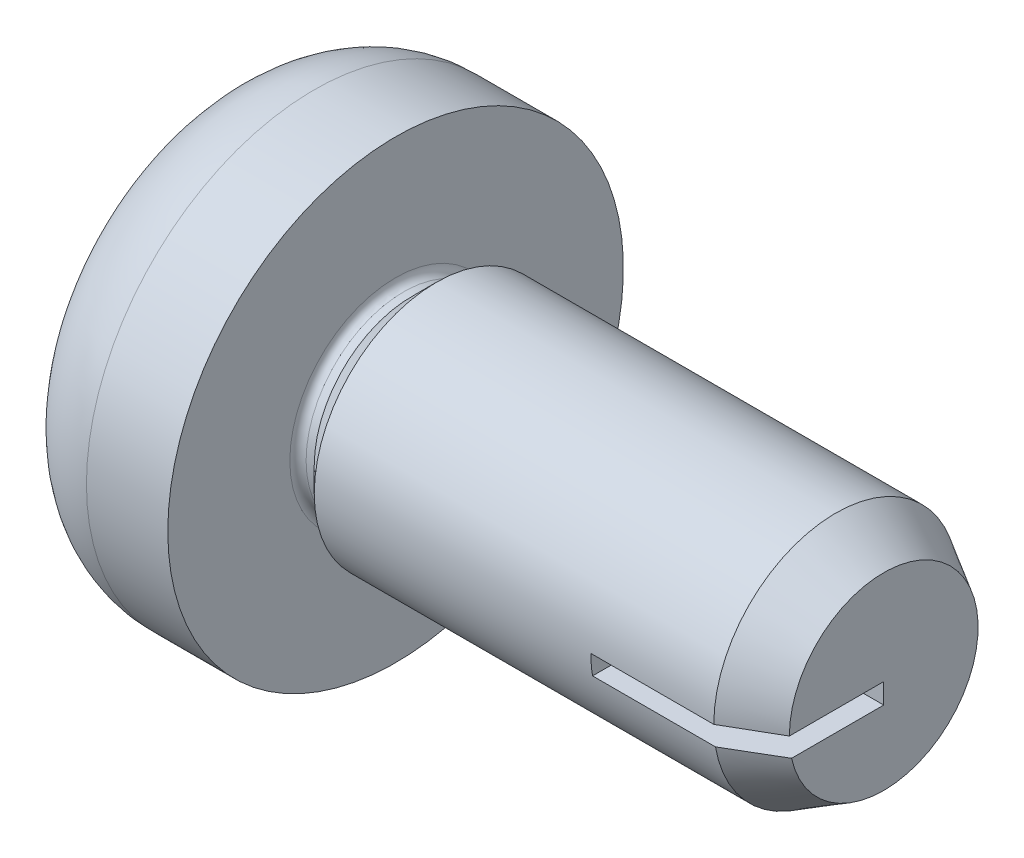
ISO-10303-21;
HEADER;
FILE_DESCRIPTION(('STEP AP214'),'2;1');
FILE_NAME('part.step','',(''),(''),'','','');
FILE_SCHEMA(('AUTOMOTIVE_DESIGN { 1 0 10303 214 1 1 1 1 }'));
ENDSEC;
DATA;
#1=APPLICATION_CONTEXT('core data for automotive mechanical design processes');
#2=APPLICATION_PROTOCOL_DEFINITION('international standard','automotive_design',2000,#1);
#3=PRODUCT_CONTEXT('',#1,'mechanical');
#4=PRODUCT('Part','Part','',(#3));
#5=PRODUCT_RELATED_PRODUCT_CATEGORY('part','',(#4));
#6=PRODUCT_DEFINITION_FORMATION('','',#4);
#7=PRODUCT_DEFINITION_CONTEXT('part definition',#1,'design');
#8=PRODUCT_DEFINITION('design','',#6,#7);
#9=PRODUCT_DEFINITION_SHAPE('','',#8);
#10=(LENGTH_UNIT() NAMED_UNIT(*) SI_UNIT(.MILLI.,.METRE.));
#11=(NAMED_UNIT(*) PLANE_ANGLE_UNIT() SI_UNIT($,.RADIAN.));
#12=(NAMED_UNIT(*) SI_UNIT($,.STERADIAN.) SOLID_ANGLE_UNIT());
#13=UNCERTAINTY_MEASURE_WITH_UNIT(LENGTH_MEASURE(1.E-05),#10,'distance_accuracy_value','');
#14=(GEOMETRIC_REPRESENTATION_CONTEXT(3) GLOBAL_UNCERTAINTY_ASSIGNED_CONTEXT((#13)) GLOBAL_UNIT_ASSIGNED_CONTEXT((#10,
#11,#12)) REPRESENTATION_CONTEXT('',''));
#15=CARTESIAN_POINT('',(0.,0.,0.));
#16=DIRECTION('',(0.,0.,1.));
#17=DIRECTION('',(1.,0.,0.));
#18=AXIS2_PLACEMENT_3D('',#15,#16,#17);
#19=CARTESIAN_POINT('',(0.,0.,0.));
#20=DIRECTION('',(-1.,0.,0.));
#21=DIRECTION('',(0.,0.,1.));
#22=AXIS2_PLACEMENT_3D('',#19,#20,#21);
#23=CYLINDRICAL_SURFACE('',#22,1.5);
#24=CARTESIAN_POINT('',(2.7,0.,0.));
#25=DIRECTION('',(-1.,0.,0.));
#26=DIRECTION('',(0.,0.,1.));
#27=AXIS2_PLACEMENT_3D('',#24,#25,#26);
#28=CIRCLE('',#27,1.5);
#29=CARTESIAN_POINT('',(2.7,0.,1.5));
#30=VERTEX_POINT('',#29);
#31=EDGE_CURVE('E240',#30,#30,#28,.T.);
#32=ORIENTED_EDGE('',*,*,#31,.F.);
#33=EDGE_LOOP('',(#32));
#34=FACE_BOUND('',#33,.T.);
#35=DIRECTION('',(-1.,0.,0.));
#36=VECTOR('',#35,1.);
#37=CARTESIAN_POINT('',(0.,0.,1.5));
#38=LINE('',#37,#36);
#39=CARTESIAN_POINT('',(7.61110272542657,0.,1.5));
#40=VERTEX_POINT('',#39);
#41=CARTESIAN_POINT('',(6.1,0.,1.5));
#42=VERTEX_POINT('',#41);
#43=EDGE_CURVE('E382',#40,#42,#38,.T.);
#44=ORIENTED_EDGE('',*,*,#43,.F.);
#45=CARTESIAN_POINT('',(7.61110272542657,0.,0.));
#46=DIRECTION('',(-1.,0.,0.));
#47=DIRECTION('',(0.,0.,1.));
#48=AXIS2_PLACEMENT_3D('',#45,#46,#47);
#49=CIRCLE('',#48,1.5);
#50=CARTESIAN_POINT('',(7.61110272542657,-0.25,1.4790199457749));
#51=VERTEX_POINT('',#50);
#52=EDGE_CURVE('E379',#40,#51,#49,.T.);
#53=ORIENTED_EDGE('',*,*,#52,.T.);
#54=DIRECTION('',(-1.,0.,0.));
#55=VECTOR('',#54,1.);
#56=CARTESIAN_POINT('',(0.,-0.250000000000001,1.4790199457749));
#57=LINE('',#56,#55);
#58=CARTESIAN_POINT('',(6.1,-0.25,1.4790199457749));
#59=VERTEX_POINT('',#58);
#60=EDGE_CURVE('E386',#59,#51,#57,.F.);
#61=ORIENTED_EDGE('',*,*,#60,.F.);
#62=CARTESIAN_POINT('',(6.1,0.,0.));
#63=DIRECTION('',(1.,0.,0.));
#64=DIRECTION('',(0.,0.,-1.));
#65=AXIS2_PLACEMENT_3D('',#62,#63,#64);
#66=CIRCLE('',#65,1.5);
#67=EDGE_CURVE('E47',#42,#59,#66,.T.);
#68=ORIENTED_EDGE('',*,*,#67,.F.);
#69=EDGE_LOOP('',(#44,#53,#61,#68));
#70=FACE_BOUND('',#69,.T.);
#71=ADVANCED_FACE('F76',(#34,#70),#23,.T.);
#72=CARTESIAN_POINT('',(7.61110272542657,0.,0.));
#73=DIRECTION('',(-1.,0.,0.));
#74=DIRECTION('',(0.,0.,1.));
#75=AXIS2_PLACEMENT_3D('',#72,#73,#74);
#76=CONICAL_SURFACE('',#75,1.5,0.523598775598293);
#77=ORIENTED_EDGE('',*,*,#52,.F.);
#78=DIRECTION('',(-0.866025403784442,0.,0.499999999999995));
#79=VECTOR('',#78,1.);
#80=CARTESIAN_POINT('',(10.2091789367799,0.,0.));
#81=LINE('',#80,#79);
#82=CARTESIAN_POINT('',(8.2,0.,1.16));
#83=VERTEX_POINT('',#82);
#84=EDGE_CURVE('E384',#40,#83,#81,.F.);
#85=ORIENTED_EDGE('',*,*,#84,.T.);
#86=CARTESIAN_POINT('',(8.2,0.,0.));
#87=DIRECTION('',(-1.,0.,0.));
#88=DIRECTION('',(0.,0.,1.));
#89=AXIS2_PLACEMENT_3D('',#86,#87,#88);
#90=CIRCLE('',#89,1.16);
#91=CARTESIAN_POINT('',(8.2,-0.25,1.13274004078606));
#92=VERTEX_POINT('',#91);
#93=EDGE_CURVE('E238',#83,#92,#90,.T.);
#94=ORIENTED_EDGE('',*,*,#93,.T.);
#95=CARTESIAN_POINT('',(9.41814185697318,-0.25,0.382203986386483));
#96=CARTESIAN_POINT('',(9.39723319512439,-0.25,0.396622432472531));
#97=CARTESIAN_POINT('',(9.37621736160206,-0.25,0.410883489403972));
#98=CARTESIAN_POINT('',(9.3340175932902,-0.25,0.439152569856273));
#99=CARTESIAN_POINT('',(9.31283366728643,-0.25,0.453160606478108));
#100=CARTESIAN_POINT('',(9.24910170124372,-0.25,0.494896164896426));
#101=CARTESIAN_POINT('',(9.20636766970512,-0.25,0.522339085516596));
#102=CARTESIAN_POINT('',(9.12060440125441,-0.25,0.576735461075968));
#103=CARTESIAN_POINT('',(9.07757523356054,-0.25,0.603689025716695));
#104=CARTESIAN_POINT('',(8.9913095492911,-0.25,0.657266142328872));
#105=CARTESIAN_POINT('',(8.9480730235488,-0.25,0.683889679520685));
#106=CARTESIAN_POINT('',(8.8218598791878,-0.25,0.761143065792755));
#107=CARTESIAN_POINT('',(8.73869474512981,-0.25,0.811464507635569));
#108=CARTESIAN_POINT('',(8.5720741029365,-0.25,0.911624729010411));
#109=CARTESIAN_POINT('',(8.48861859150198,-0.25,0.961463503033985));
#110=CARTESIAN_POINT('',(8.23795252732004,-0.25,1.11055290730823));
#111=CARTESIAN_POINT('',(8.07047613568723,-0.25,1.20935625450731));
#112=CARTESIAN_POINT('',(7.77526163481782,-0.25,1.3828718387951));
#113=CARTESIAN_POINT('',(7.64759083644122,-0.25,1.45769905707308));
#114=CARTESIAN_POINT('',(7.39212620609127,-0.25,1.60714336352689));
#115=CARTESIAN_POINT('',(7.26433237410952,-0.25,1.68176045168836));
#116=CARTESIAN_POINT('',(7.0087172173291,-0.25,1.83082709807698));
#117=CARTESIAN_POINT('',(6.88089592520653,-0.25,1.90527671238543));
#118=CARTESIAN_POINT('',(6.62519555777105,-0.25,2.05407620843158));
#119=CARTESIAN_POINT('',(6.49731648254642,-0.25,2.12842609032095));
#120=CARTESIAN_POINT('',(6.36941931140605,-0.25,2.20274480142775));
#121=B_SPLINE_CURVE_WITH_KNOTS('',3,(#95,#96,#97,#98,#99,#100,#101,#102,#103,#104,#105,#106,
#107,#108,#109,#110,#111,#112,#113,#114,#115,#116,#117,#118,#119,#120),.UNSPECIFIED.,.F.,.F.,(4,
2,2,2,2,2,2,2,2,2,2,2,4),(0.,0.076191962796665,0.152379969123876,0.304734924671154,
0.457055293432602,0.60938245909972,0.90099209824417,1.19260506147505,1.77594908814432,
2.2198978958494,2.6638467338862,3.10761381509469,3.55138022062236),.UNSPECIFIED.);
#122=EDGE_CURVE('E388',#92,#51,#121,.T.);
#123=ORIENTED_EDGE('',*,*,#122,.T.);
#124=EDGE_LOOP('',(#77,#85,#94,#123));
#125=FACE_BOUND('',#124,.T.);
#126=ADVANCED_FACE('F398',(#125),#76,.T.);
#127=CARTESIAN_POINT('',(8.2,1.5,0.));
#128=DIRECTION('',(-1.,0.,0.));
#129=DIRECTION('',(0.,0.,1.));
#130=AXIS2_PLACEMENT_3D('',#127,#128,#129);
#131=PLANE('',#130);
#132=DIRECTION('',(0.,0.,1.));
#133=VECTOR('',#132,1.);
#134=CARTESIAN_POINT('',(8.2,0.,0.));
#135=LINE('',#134,#133);
#136=CARTESIAN_POINT('',(8.2,0.,0.));
#137=VERTEX_POINT('',#136);
#138=EDGE_CURVE('E84',#137,#83,#135,.T.);
#139=ORIENTED_EDGE('',*,*,#138,.F.);
#140=DIRECTION('',(0.,1.,0.));
#141=VECTOR('',#140,1.);
#142=CARTESIAN_POINT('',(8.2,0.,0.));
#143=LINE('',#142,#141);
#144=CARTESIAN_POINT('',(8.2,-0.25,0.));
#145=VERTEX_POINT('',#144);
#146=EDGE_CURVE('E228',#145,#137,#143,.T.);
#147=ORIENTED_EDGE('',*,*,#146,.F.);
#148=DIRECTION('',(0.,0.,-1.));
#149=VECTOR('',#148,1.);
#150=CARTESIAN_POINT('',(8.2,-0.25,0.));
#151=LINE('',#150,#149);
#152=EDGE_CURVE('E239',#92,#145,#151,.T.);
#153=ORIENTED_EDGE('',*,*,#152,.F.);
#154=ORIENTED_EDGE('',*,*,#93,.F.);
#155=EDGE_LOOP('',(#139,#147,#153,#154));
#156=FACE_BOUND('',#155,.T.);
#157=ADVANCED_FACE('F236',(#156),#131,.F.);
#158=CARTESIAN_POINT('',(0.,0.,0.));
#159=DIRECTION('',(1.,0.,0.));
#160=DIRECTION('',(0.,0.,-1.));
#161=AXIS2_PLACEMENT_3D('',#158,#159,#160);
#162=PLANE('',#161);
#163=CARTESIAN_POINT('',(0.,0.,0.));
#164=DIRECTION('',(-1.,0.,0.));
#165=DIRECTION('',(0.,0.,1.));
#166=AXIS2_PLACEMENT_3D('',#163,#164,#165);
#167=CIRCLE('',#166,1.6);
#168=CARTESIAN_POINT('',(0.,0.,1.6));
#169=VERTEX_POINT('',#168);
#170=EDGE_CURVE('E266',#169,#169,#167,.T.);
#171=ORIENTED_EDGE('',*,*,#170,.T.);
#172=EDGE_LOOP('',(#171));
#173=FACE_BOUND('',#172,.T.);
#174=DIRECTION('',(0.,0.,-1.));
#175=VECTOR('',#174,1.);
#176=CARTESIAN_POINT('',(0.,-0.395,0.394999999999999));
#177=LINE('',#176,#175);
#178=CARTESIAN_POINT('',(0.,-0.395,1.55));
#179=VERTEX_POINT('',#178);
#180=CARTESIAN_POINT('',(0.,-0.395,0.704999999999999));
#181=VERTEX_POINT('',#180);
#182=EDGE_CURVE('E315',#179,#181,#177,.T.);
#183=ORIENTED_EDGE('',*,*,#182,.T.);
#184=DIRECTION('',(0.,0.707106781186548,0.707106781186547));
#185=VECTOR('',#184,1.);
#186=CARTESIAN_POINT('',(0.,-0.705,0.394999999999999));
#187=LINE('',#186,#185);
#188=CARTESIAN_POINT('',(0.,-0.705,0.394999999999999));
#189=VERTEX_POINT('',#188);
#190=EDGE_CURVE('E374',#189,#181,#187,.T.);
#191=ORIENTED_EDGE('',*,*,#190,.F.);
#192=DIRECTION('',(0.,-1.,0.));
#193=VECTOR('',#192,1.);
#194=CARTESIAN_POINT('',(0.,-0.395,0.394999999999999));
#195=LINE('',#194,#193);
#196=CARTESIAN_POINT('',(0.,-1.55,0.395));
#197=VERTEX_POINT('',#196);
#198=EDGE_CURVE('E313',#189,#197,#195,.T.);
#199=ORIENTED_EDGE('',*,*,#198,.T.);
#200=DIRECTION('',(0.,0.,-1.));
#201=VECTOR('',#200,1.);
#202=CARTESIAN_POINT('',(0.,-1.55,-0.395));
#203=LINE('',#202,#201);
#204=CARTESIAN_POINT('',(0.,-1.55,-0.395));
#205=VERTEX_POINT('',#204);
#206=EDGE_CURVE('E310',#197,#205,#203,.T.);
#207=ORIENTED_EDGE('',*,*,#206,.T.);
#208=DIRECTION('',(0.,1.,0.));
#209=VECTOR('',#208,1.);
#210=CARTESIAN_POINT('',(0.,-0.395,-0.395));
#211=LINE('',#210,#209);
#212=CARTESIAN_POINT('',(0.,-0.705,-0.394999999999999));
#213=VERTEX_POINT('',#212);
#214=EDGE_CURVE('E307',#205,#213,#211,.T.);
#215=ORIENTED_EDGE('',*,*,#214,.T.);
#216=DIRECTION('',(0.,-0.707106781186548,0.707106781186547));
#217=VECTOR('',#216,1.);
#218=CARTESIAN_POINT('',(0.,-0.705,-0.394999999999999));
#219=LINE('',#218,#217);
#220=CARTESIAN_POINT('',(0.,-0.395,-0.704999999999999));
#221=VERTEX_POINT('',#220);
#222=EDGE_CURVE('E365',#221,#213,#219,.T.);
#223=ORIENTED_EDGE('',*,*,#222,.F.);
#224=DIRECTION('',(0.,0.,-1.));
#225=VECTOR('',#224,1.);
#226=CARTESIAN_POINT('',(0.,-0.395,-1.55));
#227=LINE('',#226,#225);
#228=CARTESIAN_POINT('',(0.,-0.395,-1.55));
#229=VERTEX_POINT('',#228);
#230=EDGE_CURVE('E305',#221,#229,#227,.T.);
#231=ORIENTED_EDGE('',*,*,#230,.T.);
#232=DIRECTION('',(0.,1.,0.));
#233=VECTOR('',#232,1.);
#234=CARTESIAN_POINT('',(0.,0.395,-1.55));
#235=LINE('',#234,#233);
#236=CARTESIAN_POINT('',(0.,0.395,-1.55));
#237=VERTEX_POINT('',#236);
#238=EDGE_CURVE('E302',#229,#237,#235,.T.);
#239=ORIENTED_EDGE('',*,*,#238,.T.);
#240=DIRECTION('',(0.,0.,1.));
#241=VECTOR('',#240,1.);
#242=CARTESIAN_POINT('',(0.,0.395,-1.55));
#243=LINE('',#242,#241);
#244=CARTESIAN_POINT('',(0.,0.395,-0.704999999999999));
#245=VERTEX_POINT('',#244);
#246=EDGE_CURVE('E299',#237,#245,#243,.T.);
#247=ORIENTED_EDGE('',*,*,#246,.T.);
#248=DIRECTION('',(0.,-0.707106781186548,-0.707106781186547));
#249=VECTOR('',#248,1.);
#250=CARTESIAN_POINT('',(0.,0.705,-0.395));
#251=LINE('',#250,#249);
#252=CARTESIAN_POINT('',(0.,0.705,-0.395));
#253=VERTEX_POINT('',#252);
#254=EDGE_CURVE('E357',#253,#245,#251,.T.);
#255=ORIENTED_EDGE('',*,*,#254,.F.);
#256=DIRECTION('',(0.,1.,0.));
#257=VECTOR('',#256,1.);
#258=CARTESIAN_POINT('',(0.,1.55,-0.395));
#259=LINE('',#258,#257);
#260=CARTESIAN_POINT('',(0.,1.55,-0.395));
#261=VERTEX_POINT('',#260);
#262=EDGE_CURVE('E329',#253,#261,#259,.T.);
#263=ORIENTED_EDGE('',*,*,#262,.T.);
#264=DIRECTION('',(0.,0.,1.));
#265=VECTOR('',#264,1.);
#266=CARTESIAN_POINT('',(0.,1.55,-0.395));
#267=LINE('',#266,#265);
#268=CARTESIAN_POINT('',(0.,1.55,0.395));
#269=VERTEX_POINT('',#268);
#270=EDGE_CURVE('E326',#261,#269,#267,.T.);
#271=ORIENTED_EDGE('',*,*,#270,.T.);
#272=DIRECTION('',(0.,-1.,0.));
#273=VECTOR('',#272,1.);
#274=CARTESIAN_POINT('',(0.,1.55,0.395));
#275=LINE('',#274,#273);
#276=CARTESIAN_POINT('',(0.,0.705,0.395));
#277=VERTEX_POINT('',#276);
#278=EDGE_CURVE('E323',#269,#277,#275,.T.);
#279=ORIENTED_EDGE('',*,*,#278,.T.);
#280=DIRECTION('',(0.,0.707106781186548,-0.707106781186547));
#281=VECTOR('',#280,1.);
#282=CARTESIAN_POINT('',(0.,0.705,0.395));
#283=LINE('',#282,#281);
#284=CARTESIAN_POINT('',(0.,0.395,0.704999999999999));
#285=VERTEX_POINT('',#284);
#286=EDGE_CURVE('E347',#285,#277,#283,.T.);
#287=ORIENTED_EDGE('',*,*,#286,.F.);
#288=DIRECTION('',(0.,0.,1.));
#289=VECTOR('',#288,1.);
#290=CARTESIAN_POINT('',(0.,0.395,0.394999999999999));
#291=LINE('',#290,#289);
#292=CARTESIAN_POINT('',(0.,0.395,1.55));
#293=VERTEX_POINT('',#292);
#294=EDGE_CURVE('E321',#285,#293,#291,.T.);
#295=ORIENTED_EDGE('',*,*,#294,.T.);
#296=DIRECTION('',(0.,-1.,0.));
#297=VECTOR('',#296,1.);
#298=CARTESIAN_POINT('',(0.,0.395,1.55));
#299=LINE('',#298,#297);
#300=EDGE_CURVE('E318',#293,#179,#299,.T.);
#301=ORIENTED_EDGE('',*,*,#300,.T.);
#302=EDGE_LOOP('',(#183,#191,#199,#207,#215,#223,#231,#239,#247,#255,#263,#271,#279,#287,#295,#301));
#303=FACE_BOUND('',#302,.T.);
#304=ADVANCED_FACE('F430',(#173,#303),#162,.F.);
#305=CARTESIAN_POINT('',(2.7,0.,0.));
#306=DIRECTION('',(1.,0.,0.));
#307=DIRECTION('',(0.,0.,-1.));
#308=AXIS2_PLACEMENT_3D('',#305,#306,#307);
#309=CONICAL_SURFACE('',#308,1.5,0.785398163397452);
#310=CARTESIAN_POINT('',(2.4,0.,0.));
#311=DIRECTION('',(-1.,0.,0.));
#312=DIRECTION('',(0.,0.,1.));
#313=AXIS2_PLACEMENT_3D('',#310,#311,#312);
#314=CIRCLE('',#313,1.2);
#315=CARTESIAN_POINT('',(2.4,0.,1.2));
#316=VERTEX_POINT('',#315);
#317=EDGE_CURVE('E282',#316,#316,#314,.T.);
#318=ORIENTED_EDGE('',*,*,#317,.F.);
#319=EDGE_LOOP('',(#318));
#320=FACE_BOUND('',#319,.T.);
#321=ORIENTED_EDGE('',*,*,#31,.T.);
#322=EDGE_LOOP('',(#321));
#323=FACE_BOUND('',#322,.T.);
#324=ADVANCED_FACE('F426',(#320,#323),#309,.T.);
#325=CARTESIAN_POINT('',(0.,0.,0.));
#326=DIRECTION('',(-1.,0.,0.));
#327=DIRECTION('',(0.,0.,1.));
#328=AXIS2_PLACEMENT_3D('',#325,#326,#327);
#329=CYLINDRICAL_SURFACE('',#328,1.2);
#330=CARTESIAN_POINT('',(2.3,0.,0.));
#331=DIRECTION('',(-1.,0.,0.));
#332=DIRECTION('',(0.,0.,1.));
#333=AXIS2_PLACEMENT_3D('',#330,#331,#332);
#334=CIRCLE('',#333,1.2);
#335=CARTESIAN_POINT('',(2.3,0.,1.2));
#336=VERTEX_POINT('',#335);
#337=EDGE_CURVE('E285',#336,#336,#334,.T.);
#338=ORIENTED_EDGE('',*,*,#337,.F.);
#339=EDGE_LOOP('',(#338));
#340=FACE_BOUND('',#339,.T.);
#341=ORIENTED_EDGE('',*,*,#317,.T.);
#342=EDGE_LOOP('',(#341));
#343=FACE_BOUND('',#342,.T.);
#344=ADVANCED_FACE('F553',(#340,#343),#329,.T.);
#345=CARTESIAN_POINT('',(2.3,0.,0.));
#346=DIRECTION('',(-1.,0.,0.));
#347=DIRECTION('',(0.,0.,1.));
#348=AXIS2_PLACEMENT_3D('',#345,#346,#347);
#349=TOROIDAL_SURFACE('',#348,1.3,0.1);
#350=CARTESIAN_POINT('',(2.2,0.,0.));
#351=DIRECTION('',(-1.,0.,0.));
#352=DIRECTION('',(0.,0.,1.));
#353=AXIS2_PLACEMENT_3D('',#350,#351,#352);
#354=CIRCLE('',#353,1.3);
#355=CARTESIAN_POINT('',(2.2,0.,1.3));
#356=VERTEX_POINT('',#355);
#357=EDGE_CURVE('E288',#356,#356,#354,.T.);
#358=ORIENTED_EDGE('',*,*,#357,.F.);
#359=EDGE_LOOP('',(#358));
#360=FACE_BOUND('',#359,.T.);
#361=ORIENTED_EDGE('',*,*,#337,.T.);
#362=EDGE_LOOP('',(#361));
#363=FACE_BOUND('',#362,.T.);
#364=ADVANCED_FACE('F550',(#360,#363),#349,.F.);
#365=CARTESIAN_POINT('',(2.2,2.8,0.));
#366=DIRECTION('',(-1.,0.,0.));
#367=DIRECTION('',(0.,0.,1.));
#368=AXIS2_PLACEMENT_3D('',#365,#366,#367);
#369=PLANE('',#368);
#370=CARTESIAN_POINT('',(2.2,0.,0.));
#371=DIRECTION('',(-1.,0.,0.));
#372=DIRECTION('',(0.,0.,1.));
#373=AXIS2_PLACEMENT_3D('',#370,#371,#372);
#374=CIRCLE('',#373,2.8);
#375=CARTESIAN_POINT('',(2.2,0.,2.8));
#376=VERTEX_POINT('',#375);
#377=EDGE_CURVE('E291',#376,#376,#374,.T.);
#378=ORIENTED_EDGE('',*,*,#377,.F.);
#379=EDGE_LOOP('',(#378));
#380=FACE_BOUND('',#379,.T.);
#381=ORIENTED_EDGE('',*,*,#357,.T.);
#382=EDGE_LOOP('',(#381));
#383=FACE_BOUND('',#382,.T.);
#384=ADVANCED_FACE('F546',(#380,#383),#369,.F.);
#385=CARTESIAN_POINT('',(0.,0.,0.));
#386=DIRECTION('',(-1.,0.,0.));
#387=DIRECTION('',(0.,0.,1.));
#388=AXIS2_PLACEMENT_3D('',#385,#386,#387);
#389=CYLINDRICAL_SURFACE('',#388,2.8);
#390=CARTESIAN_POINT('',(1.2,0.,0.));
#391=DIRECTION('',(-1.,0.,0.));
#392=DIRECTION('',(0.,0.,1.));
#393=AXIS2_PLACEMENT_3D('',#390,#391,#392);
#394=CIRCLE('',#393,2.8);
#395=CARTESIAN_POINT('',(1.2,0.,2.8));
#396=VERTEX_POINT('',#395);
#397=EDGE_CURVE('E294',#396,#396,#394,.T.);
#398=ORIENTED_EDGE('',*,*,#397,.F.);
#399=EDGE_LOOP('',(#398));
#400=FACE_BOUND('',#399,.T.);
#401=ORIENTED_EDGE('',*,*,#377,.T.);
#402=EDGE_LOOP('',(#401));
#403=FACE_BOUND('',#402,.T.);
#404=ADVANCED_FACE('F542',(#400,#403),#389,.T.);
#405=CARTESIAN_POINT('',(1.2,0.,0.));
#406=DIRECTION('',(-1.,0.,0.));
#407=DIRECTION('',(0.,0.,1.));
#408=AXIS2_PLACEMENT_3D('',#405,#406,#407);
#409=TOROIDAL_SURFACE('',#408,1.6,1.2);
#410=ORIENTED_EDGE('',*,*,#170,.F.);
#411=EDGE_LOOP('',(#410));
#412=FACE_BOUND('',#411,.T.);
#413=ORIENTED_EDGE('',*,*,#397,.T.);
#414=EDGE_LOOP('',(#413));
#415=FACE_BOUND('',#414,.T.);
#416=ADVANCED_FACE('F536',(#412,#415),#409,.T.);
#417=CARTESIAN_POINT('',(1.4,1.55,-0.395));
#418=DIRECTION('',(0.,0.,1.));
#419=DIRECTION('',(1.,0.,0.));
#420=AXIS2_PLACEMENT_3D('',#417,#418,#419);
#421=PLANE('',#420);
#422=DIRECTION('',(-1.,0.,0.));
#423=VECTOR('',#422,1.);
#424=CARTESIAN_POINT('',(1.83840620433566,0.705,-0.395));
#425=LINE('',#424,#423);
#426=CARTESIAN_POINT('',(1.4,0.705,-0.395));
#427=VERTEX_POINT('',#426);
#428=EDGE_CURVE('E355',#427,#253,#425,.T.);
#429=ORIENTED_EDGE('',*,*,#428,.F.);
#430=DIRECTION('',(0.,1.,0.));
#431=VECTOR('',#430,1.);
#432=CARTESIAN_POINT('',(1.4,1.55,-0.395));
#433=LINE('',#432,#431);
#434=CARTESIAN_POINT('',(1.4,1.04044167202731,-0.395));
#435=VERTEX_POINT('',#434);
#436=EDGE_CURVE('E270',#427,#435,#433,.T.);
#437=ORIENTED_EDGE('',*,*,#436,.T.);
#438=DIRECTION('',(-0.939692620785908,0.342020143325669,0.));
#439=VECTOR('',#438,1.);
#440=CARTESIAN_POINT('',(0.,1.55,-0.395));
#441=LINE('',#440,#439);
#442=EDGE_CURVE('E263',#435,#261,#441,.T.);
#443=ORIENTED_EDGE('',*,*,#442,.T.);
#444=ORIENTED_EDGE('',*,*,#262,.F.);
#445=EDGE_LOOP('',(#429,#437,#443,#444));
#446=FACE_BOUND('',#445,.T.);
#447=ADVANCED_FACE('F503',(#446),#421,.T.);
#448=CARTESIAN_POINT('',(0.,1.55,-0.395));
#449=DIRECTION('',(-0.342020143325669,-0.939692620785908,0.));
#450=DIRECTION('',(0.939692620785908,-0.342020143325669,0.));
#451=AXIS2_PLACEMENT_3D('',#448,#449,#450);
#452=PLANE('',#451);
#453=ORIENTED_EDGE('',*,*,#270,.F.);
#454=ORIENTED_EDGE('',*,*,#442,.F.);
#455=DIRECTION('',(0.,0.,1.));
#456=VECTOR('',#455,1.);
#457=CARTESIAN_POINT('',(1.4,1.04044167202731,-0.395000000000001));
#458=LINE('',#457,#456);
#459=CARTESIAN_POINT('',(1.4,1.04044167202732,0.395));
#460=VERTEX_POINT('',#459);
#461=EDGE_CURVE('E267',#435,#460,#458,.T.);
#462=ORIENTED_EDGE('',*,*,#461,.T.);
#463=DIRECTION('',(-0.939692620785908,0.342020143325669,0.));
#464=VECTOR('',#463,1.);
#465=CARTESIAN_POINT('',(1.23623111018328,1.10004867321942,0.395));
#466=LINE('',#465,#464);
#467=EDGE_CURVE('E257',#460,#269,#466,.T.);
#468=ORIENTED_EDGE('',*,*,#467,.T.);
#469=EDGE_LOOP('',(#453,#454,#462,#468));
#470=FACE_BOUND('',#469,.T.);
#471=ADVANCED_FACE('F78',(#470),#452,.T.);
#472=CARTESIAN_POINT('',(1.4,1.55,0.395));
#473=DIRECTION('',(0.,0.,-1.));
#474=DIRECTION('',(0.,1.,0.));
#475=AXIS2_PLACEMENT_3D('',#472,#473,#474);
#476=PLANE('',#475);
#477=DIRECTION('',(-1.,0.,0.));
#478=VECTOR('',#477,1.);
#479=CARTESIAN_POINT('',(1.83840620433566,0.705,0.395));
#480=LINE('',#479,#478);
#481=CARTESIAN_POINT('',(1.4,0.705,0.395));
#482=VERTEX_POINT('',#481);
#483=EDGE_CURVE('E346',#482,#277,#480,.T.);
#484=ORIENTED_EDGE('',*,*,#483,.T.);
#485=ORIENTED_EDGE('',*,*,#278,.F.);
#486=ORIENTED_EDGE('',*,*,#467,.F.);
#487=DIRECTION('',(0.,-1.,0.));
#488=VECTOR('',#487,1.);
#489=CARTESIAN_POINT('',(1.4,1.55,0.395));
#490=LINE('',#489,#488);
#491=EDGE_CURVE('E269',#460,#482,#490,.T.);
#492=ORIENTED_EDGE('',*,*,#491,.T.);
#493=EDGE_LOOP('',(#484,#485,#486,#492));
#494=FACE_BOUND('',#493,.T.);
#495=ADVANCED_FACE('F453',(#494),#476,.T.);
#496=CARTESIAN_POINT('',(1.4,0.395,0.394999999999999));
#497=DIRECTION('',(0.,-1.,0.));
#498=DIRECTION('',(0.,0.,-1.));
#499=AXIS2_PLACEMENT_3D('',#496,#497,#498);
#500=PLANE('',#499);
#501=DIRECTION('',(-1.,0.,0.));
#502=VECTOR('',#501,1.);
#503=CARTESIAN_POINT('',(1.83840620433566,0.395,0.704999999999999));
#504=LINE('',#503,#502);
#505=CARTESIAN_POINT('',(1.4,0.395,0.704999999999999));
#506=VERTEX_POINT('',#505);
#507=EDGE_CURVE('E344',#506,#285,#504,.T.);
#508=ORIENTED_EDGE('',*,*,#507,.F.);
#509=DIRECTION('',(0.,0.,1.));
#510=VECTOR('',#509,1.);
#511=CARTESIAN_POINT('',(1.4,0.395,0.394999999999999));
#512=LINE('',#511,#510);
#513=CARTESIAN_POINT('',(1.4,0.395,1.04044167202731));
#514=VERTEX_POINT('',#513);
#515=EDGE_CURVE('E261',#506,#514,#512,.T.);
#516=ORIENTED_EDGE('',*,*,#515,.T.);
#517=DIRECTION('',(-0.939692620785908,0.,0.342020143325669));
#518=VECTOR('',#517,1.);
#519=CARTESIAN_POINT('',(0.,0.395,1.55));
#520=LINE('',#519,#518);
#521=EDGE_CURVE('E254',#514,#293,#520,.T.);
#522=ORIENTED_EDGE('',*,*,#521,.T.);
#523=ORIENTED_EDGE('',*,*,#294,.F.);
#524=EDGE_LOOP('',(#508,#516,#522,#523));
#525=FACE_BOUND('',#524,.T.);
#526=ADVANCED_FACE('F445',(#525),#500,.T.);
#527=CARTESIAN_POINT('',(0.,0.395,1.55));
#528=DIRECTION('',(-0.342020143325669,0.,-0.939692620785908));
#529=DIRECTION('',(-0.939692620785908,0.,0.342020143325669));
#530=AXIS2_PLACEMENT_3D('',#527,#528,#529);
#531=PLANE('',#530);
#532=ORIENTED_EDGE('',*,*,#300,.F.);
#533=ORIENTED_EDGE('',*,*,#521,.F.);
#534=DIRECTION('',(0.,-1.,0.));
#535=VECTOR('',#534,1.);
#536=CARTESIAN_POINT('',(1.4,0.395,1.04044167202731));
#537=LINE('',#536,#535);
#538=CARTESIAN_POINT('',(1.4,-0.395,1.04044167202731));
#539=VERTEX_POINT('',#538);
#540=EDGE_CURVE('E258',#514,#539,#537,.T.);
#541=ORIENTED_EDGE('',*,*,#540,.T.);
#542=DIRECTION('',(-0.939692620785908,0.,0.342020143325669));
#543=VECTOR('',#542,1.);
#544=CARTESIAN_POINT('',(1.60744095477726,-0.395,0.96493933912063));
#545=LINE('',#544,#543);
#546=EDGE_CURVE('E246',#539,#179,#545,.T.);
#547=ORIENTED_EDGE('',*,*,#546,.T.);
#548=EDGE_LOOP('',(#532,#533,#541,#547));
#549=FACE_BOUND('',#548,.T.);
#550=ADVANCED_FACE('F442',(#549),#531,.T.);
#551=CARTESIAN_POINT('',(1.4,-0.395,0.394999999999999));
#552=DIRECTION('',(0.,1.,0.));
#553=DIRECTION('',(0.,0.,1.));
#554=AXIS2_PLACEMENT_3D('',#551,#552,#553);
#555=PLANE('',#554);
#556=DIRECTION('',(-1.,0.,0.));
#557=VECTOR('',#556,1.);
#558=CARTESIAN_POINT('',(1.83840620433566,-0.395,0.704999999999999));
#559=LINE('',#558,#557);
#560=CARTESIAN_POINT('',(1.4,-0.395,0.704999999999998));
#561=VERTEX_POINT('',#560);
#562=EDGE_CURVE('E371',#561,#181,#559,.T.);
#563=ORIENTED_EDGE('',*,*,#562,.T.);
#564=ORIENTED_EDGE('',*,*,#182,.F.);
#565=ORIENTED_EDGE('',*,*,#546,.F.);
#566=DIRECTION('',(0.,0.,-1.));
#567=VECTOR('',#566,1.);
#568=CARTESIAN_POINT('',(1.4,-0.395,0.394999999999999));
#569=LINE('',#568,#567);
#570=EDGE_CURVE('E260',#539,#561,#569,.T.);
#571=ORIENTED_EDGE('',*,*,#570,.T.);
#572=EDGE_LOOP('',(#563,#564,#565,#571));
#573=FACE_BOUND('',#572,.T.);
#574=ADVANCED_FACE('F444',(#573),#555,.T.);
#575=CARTESIAN_POINT('',(1.4,-0.395,0.394999999999999));
#576=DIRECTION('',(0.,0.,-1.));
#577=DIRECTION('',(0.,1.,0.));
#578=AXIS2_PLACEMENT_3D('',#575,#576,#577);
#579=PLANE('',#578);
#580=DIRECTION('',(-1.,0.,0.));
#581=VECTOR('',#580,1.);
#582=CARTESIAN_POINT('',(1.83840620433566,-0.705,0.394999999999999));
#583=LINE('',#582,#581);
#584=CARTESIAN_POINT('',(1.4,-0.705,0.394999999999999));
#585=VERTEX_POINT('',#584);
#586=EDGE_CURVE('E372',#585,#189,#583,.T.);
#587=ORIENTED_EDGE('',*,*,#586,.F.);
#588=DIRECTION('',(0.,-1.,0.));
#589=VECTOR('',#588,1.);
#590=CARTESIAN_POINT('',(1.4,-0.395,0.394999999999999));
#591=LINE('',#590,#589);
#592=CARTESIAN_POINT('',(1.4,-1.04044167202732,0.394999999999999));
#593=VERTEX_POINT('',#592);
#594=EDGE_CURVE('E251',#585,#593,#591,.T.);
#595=ORIENTED_EDGE('',*,*,#594,.T.);
#596=DIRECTION('',(-0.939692620785908,-0.342020143325669,0.));
#597=VECTOR('',#596,1.);
#598=CARTESIAN_POINT('',(0.,-1.55,0.395));
#599=LINE('',#598,#597);
#600=EDGE_CURVE('E243',#593,#197,#599,.T.);
#601=ORIENTED_EDGE('',*,*,#600,.T.);
#602=ORIENTED_EDGE('',*,*,#198,.F.);
#603=EDGE_LOOP('',(#587,#595,#601,#602));
#604=FACE_BOUND('',#603,.T.);
#605=ADVANCED_FACE('F440',(#604),#579,.T.);
#606=CARTESIAN_POINT('',(0.,-1.55,-0.395));
#607=DIRECTION('',(-0.342020143325669,0.939692620785908,0.));
#608=DIRECTION('',(-0.939692620785908,-0.342020143325669,0.));
#609=AXIS2_PLACEMENT_3D('',#606,#607,#608);
#610=PLANE('',#609);
#611=ORIENTED_EDGE('',*,*,#206,.F.);
#612=ORIENTED_EDGE('',*,*,#600,.F.);
#613=DIRECTION('',(0.,0.,-1.));
#614=VECTOR('',#613,1.);
#615=CARTESIAN_POINT('',(1.4,-1.04044167202731,-0.395000000000002));
#616=LINE('',#615,#614);
#617=CARTESIAN_POINT('',(1.4,-1.04044167202731,-0.395));
#618=VERTEX_POINT('',#617);
#619=EDGE_CURVE('E248',#593,#618,#616,.T.);
#620=ORIENTED_EDGE('',*,*,#619,.T.);
#621=DIRECTION('',(-0.939692620785908,-0.342020143325669,0.));
#622=VECTOR('',#621,1.);
#623=CARTESIAN_POINT('',(1.60744095477726,-0.96493933912063,-0.395));
#624=LINE('',#623,#622);
#625=EDGE_CURVE('E247',#618,#205,#624,.T.);
#626=ORIENTED_EDGE('',*,*,#625,.T.);
#627=EDGE_LOOP('',(#611,#612,#620,#626));
#628=FACE_BOUND('',#627,.T.);
#629=ADVANCED_FACE('F437',(#628),#610,.T.);
#630=CARTESIAN_POINT('',(1.4,-0.395,-0.395));
#631=DIRECTION('',(0.,0.,1.));
#632=DIRECTION('',(1.,0.,0.));
#633=AXIS2_PLACEMENT_3D('',#630,#631,#632);
#634=PLANE('',#633);
#635=DIRECTION('',(-1.,0.,0.));
#636=VECTOR('',#635,1.);
#637=CARTESIAN_POINT('',(1.83840620433566,-0.705,-0.394999999999999));
#638=LINE('',#637,#636);
#639=CARTESIAN_POINT('',(1.4,-0.705,-0.394999999999999));
#640=VERTEX_POINT('',#639);
#641=EDGE_CURVE('E364',#640,#213,#638,.T.);
#642=ORIENTED_EDGE('',*,*,#641,.T.);
#643=ORIENTED_EDGE('',*,*,#214,.F.);
#644=ORIENTED_EDGE('',*,*,#625,.F.);
#645=DIRECTION('',(0.,1.,0.));
#646=VECTOR('',#645,1.);
#647=CARTESIAN_POINT('',(1.4,-0.395,-0.395));
#648=LINE('',#647,#646);
#649=EDGE_CURVE('E250',#618,#640,#648,.T.);
#650=ORIENTED_EDGE('',*,*,#649,.T.);
#651=EDGE_LOOP('',(#642,#643,#644,#650));
#652=FACE_BOUND('',#651,.T.);
#653=ADVANCED_FACE('F439',(#652),#634,.T.);
#654=CARTESIAN_POINT('',(1.4,-0.395,-1.55));
#655=DIRECTION('',(0.,1.,0.));
#656=DIRECTION('',(0.,0.,1.));
#657=AXIS2_PLACEMENT_3D('',#654,#655,#656);
#658=PLANE('',#657);
#659=DIRECTION('',(-1.,0.,0.));
#660=VECTOR('',#659,1.);
#661=CARTESIAN_POINT('',(1.83840620433566,-0.395,-0.704999999999999));
#662=LINE('',#661,#660);
#663=CARTESIAN_POINT('',(1.4,-0.395,-0.704999999999999));
#664=VERTEX_POINT('',#663);
#665=EDGE_CURVE('E362',#664,#221,#662,.T.);
#666=ORIENTED_EDGE('',*,*,#665,.F.);
#667=DIRECTION('',(0.,0.,-1.));
#668=VECTOR('',#667,1.);
#669=CARTESIAN_POINT('',(1.4,-0.395,-1.55));
#670=LINE('',#669,#668);
#671=CARTESIAN_POINT('',(1.4,-0.395,-1.04044167202731));
#672=VERTEX_POINT('',#671);
#673=EDGE_CURVE('E278',#664,#672,#670,.T.);
#674=ORIENTED_EDGE('',*,*,#673,.T.);
#675=DIRECTION('',(-0.939692620785908,0.,-0.342020143325669));
#676=VECTOR('',#675,1.);
#677=CARTESIAN_POINT('',(0.,-0.395,-1.55));
#678=LINE('',#677,#676);
#679=EDGE_CURVE('E253',#672,#229,#678,.T.);
#680=ORIENTED_EDGE('',*,*,#679,.T.);
#681=ORIENTED_EDGE('',*,*,#230,.F.);
#682=EDGE_LOOP('',(#666,#674,#680,#681));
#683=FACE_BOUND('',#682,.T.);
#684=ADVANCED_FACE('F435',(#683),#658,.T.);
#685=CARTESIAN_POINT('',(0.,0.395,-1.55));
#686=DIRECTION('',(-0.342020143325669,0.,0.939692620785908));
#687=DIRECTION('',(0.939692620785908,0.,0.342020143325669));
#688=AXIS2_PLACEMENT_3D('',#685,#686,#687);
#689=PLANE('',#688);
#690=ORIENTED_EDGE('',*,*,#238,.F.);
#691=ORIENTED_EDGE('',*,*,#679,.F.);
#692=DIRECTION('',(0.,1.,0.));
#693=VECTOR('',#692,1.);
#694=CARTESIAN_POINT('',(1.4,0.395,-1.04044167202731));
#695=LINE('',#694,#693);
#696=CARTESIAN_POINT('',(1.4,0.395,-1.04044167202731));
#697=VERTEX_POINT('',#696);
#698=EDGE_CURVE('E275',#672,#697,#695,.T.);
#699=ORIENTED_EDGE('',*,*,#698,.T.);
#700=DIRECTION('',(-0.939692620785908,0.,-0.342020143325669));
#701=VECTOR('',#700,1.);
#702=CARTESIAN_POINT('',(1.23623111018328,0.395,-1.10004867321942));
#703=LINE('',#702,#701);
#704=EDGE_CURVE('E274',#697,#237,#703,.T.);
#705=ORIENTED_EDGE('',*,*,#704,.T.);
#706=EDGE_LOOP('',(#690,#691,#699,#705));
#707=FACE_BOUND('',#706,.T.);
#708=ADVANCED_FACE('F431',(#707),#689,.T.);
#709=CARTESIAN_POINT('',(1.4,0.395,-1.55));
#710=DIRECTION('',(0.,-1.,0.));
#711=DIRECTION('',(0.,0.,-1.));
#712=AXIS2_PLACEMENT_3D('',#709,#710,#711);
#713=PLANE('',#712);
#714=DIRECTION('',(-1.,0.,0.));
#715=VECTOR('',#714,1.);
#716=CARTESIAN_POINT('',(1.83840620433566,0.395,-0.704999999999999));
#717=LINE('',#716,#715);
#718=CARTESIAN_POINT('',(1.4,0.395,-0.704999999999999));
#719=VERTEX_POINT('',#718);
#720=EDGE_CURVE('E354',#719,#245,#717,.T.);
#721=ORIENTED_EDGE('',*,*,#720,.T.);
#722=ORIENTED_EDGE('',*,*,#246,.F.);
#723=ORIENTED_EDGE('',*,*,#704,.F.);
#724=DIRECTION('',(0.,0.,1.));
#725=VECTOR('',#724,1.);
#726=CARTESIAN_POINT('',(1.4,0.395,-1.55));
#727=LINE('',#726,#725);
#728=EDGE_CURVE('E277',#697,#719,#727,.T.);
#729=ORIENTED_EDGE('',*,*,#728,.T.);
#730=EDGE_LOOP('',(#721,#722,#723,#729));
#731=FACE_BOUND('',#730,.T.);
#732=ADVANCED_FACE('F434',(#731),#713,.T.);
#733=CARTESIAN_POINT('',(1.4,0.395,-0.395));
#734=DIRECTION('',(-1.,0.,0.));
#735=DIRECTION('',(0.,0.,1.));
#736=AXIS2_PLACEMENT_3D('',#733,#734,#735);
#737=PLANE('',#736);
#738=ORIENTED_EDGE('',*,*,#594,.F.);
#739=DIRECTION('',(0.,-0.707106781186548,-0.707106781186547));
#740=VECTOR('',#739,1.);
#741=CARTESIAN_POINT('',(1.4,-0.705,0.394999999999999));
#742=LINE('',#741,#740);
#743=EDGE_CURVE('E99',#561,#585,#742,.T.);
#744=ORIENTED_EDGE('',*,*,#743,.F.);
#745=ORIENTED_EDGE('',*,*,#570,.F.);
#746=ORIENTED_EDGE('',*,*,#540,.F.);
#747=ORIENTED_EDGE('',*,*,#515,.F.);
#748=DIRECTION('',(0.,-0.707106781186548,0.707106781186547));
#749=VECTOR('',#748,1.);
#750=CARTESIAN_POINT('',(1.4,0.705,0.395));
#751=LINE('',#750,#749);
#752=EDGE_CURVE('E331',#482,#506,#751,.T.);
#753=ORIENTED_EDGE('',*,*,#752,.F.);
#754=ORIENTED_EDGE('',*,*,#491,.F.);
#755=ORIENTED_EDGE('',*,*,#461,.F.);
#756=ORIENTED_EDGE('',*,*,#436,.F.);
#757=DIRECTION('',(0.,0.707106781186548,0.707106781186547));
#758=VECTOR('',#757,1.);
#759=CARTESIAN_POINT('',(1.4,0.705,-0.395));
#760=LINE('',#759,#758);
#761=EDGE_CURVE('E351',#719,#427,#760,.T.);
#762=ORIENTED_EDGE('',*,*,#761,.F.);
#763=ORIENTED_EDGE('',*,*,#728,.F.);
#764=ORIENTED_EDGE('',*,*,#698,.F.);
#765=ORIENTED_EDGE('',*,*,#673,.F.);
#766=DIRECTION('',(0.,0.707106781186548,-0.707106781186547));
#767=VECTOR('',#766,1.);
#768=CARTESIAN_POINT('',(1.4,-0.705,-0.394999999999999));
#769=LINE('',#768,#767);
#770=EDGE_CURVE('E361',#640,#664,#769,.T.);
#771=ORIENTED_EDGE('',*,*,#770,.F.);
#772=ORIENTED_EDGE('',*,*,#649,.F.);
#773=ORIENTED_EDGE('',*,*,#619,.F.);
#774=EDGE_LOOP('',(#738,#744,#745,#746,#747,#753,#754,#755,#756,#762,#763,#764,#765,#771,#772,#773));
#775=FACE_BOUND('',#774,.T.);
#776=ADVANCED_FACE('F467',(#775),#737,.T.);
#777=CARTESIAN_POINT('',(1.83840620433566,0.705,0.395));
#778=DIRECTION('',(0.,0.707106781186547,0.707106781186548));
#779=DIRECTION('',(0.,-0.707106781186548,0.707106781186547));
#780=AXIS2_PLACEMENT_3D('',#777,#778,#779);
#781=PLANE('',#780);
#782=ORIENTED_EDGE('',*,*,#752,.T.);
#783=ORIENTED_EDGE('',*,*,#507,.T.);
#784=ORIENTED_EDGE('',*,*,#286,.T.);
#785=ORIENTED_EDGE('',*,*,#483,.F.);
#786=EDGE_LOOP('',(#782,#783,#784,#785));
#787=FACE_BOUND('',#786,.T.);
#788=ADVANCED_FACE('F512',(#787),#781,.F.);
#789=CARTESIAN_POINT('',(1.83840620433566,0.705,-0.395));
#790=DIRECTION('',(0.,0.707106781186547,-0.707106781186548));
#791=DIRECTION('',(0.,0.707106781186548,0.707106781186547));
#792=AXIS2_PLACEMENT_3D('',#789,#790,#791);
#793=PLANE('',#792);
#794=ORIENTED_EDGE('',*,*,#761,.T.);
#795=ORIENTED_EDGE('',*,*,#428,.T.);
#796=ORIENTED_EDGE('',*,*,#254,.T.);
#797=ORIENTED_EDGE('',*,*,#720,.F.);
#798=EDGE_LOOP('',(#794,#795,#796,#797));
#799=FACE_BOUND('',#798,.T.);
#800=ADVANCED_FACE('F514',(#799),#793,.F.);
#801=CARTESIAN_POINT('',(1.83840620433566,-0.705,-0.394999999999999));
#802=DIRECTION('',(0.,-0.707106781186547,-0.707106781186548));
#803=DIRECTION('',(0.,0.707106781186548,-0.707106781186547));
#804=AXIS2_PLACEMENT_3D('',#801,#802,#803);
#805=PLANE('',#804);
#806=ORIENTED_EDGE('',*,*,#770,.T.);
#807=ORIENTED_EDGE('',*,*,#665,.T.);
#808=ORIENTED_EDGE('',*,*,#222,.T.);
#809=ORIENTED_EDGE('',*,*,#641,.F.);
#810=EDGE_LOOP('',(#806,#807,#808,#809));
#811=FACE_BOUND('',#810,.T.);
#812=ADVANCED_FACE('F485',(#811),#805,.F.);
#813=CARTESIAN_POINT('',(1.83840620433566,-0.705,0.394999999999999));
#814=DIRECTION('',(0.,-0.707106781186547,0.707106781186548));
#815=DIRECTION('',(0.,-0.707106781186548,-0.707106781186547));
#816=AXIS2_PLACEMENT_3D('',#813,#814,#815);
#817=PLANE('',#816);
#818=ORIENTED_EDGE('',*,*,#743,.T.);
#819=ORIENTED_EDGE('',*,*,#586,.T.);
#820=ORIENTED_EDGE('',*,*,#190,.T.);
#821=ORIENTED_EDGE('',*,*,#562,.F.);
#822=EDGE_LOOP('',(#818,#819,#820,#821));
#823=FACE_BOUND('',#822,.T.);
#824=ADVANCED_FACE('F410',(#823),#817,.F.);
#825=CARTESIAN_POINT('',(6.1,0.,2.8));
#826=DIRECTION('',(1.,0.,0.));
#827=DIRECTION('',(0.,0.,-1.));
#828=AXIS2_PLACEMENT_3D('',#825,#826,#827);
#829=PLANE('',#828);
#830=ORIENTED_EDGE('',*,*,#67,.T.);
#831=DIRECTION('',(0.,0.,-1.));
#832=VECTOR('',#831,1.);
#833=CARTESIAN_POINT('',(6.1,-0.25,2.8));
#834=LINE('',#833,#832);
#835=CARTESIAN_POINT('',(6.1,-0.25,0.));
#836=VERTEX_POINT('',#835);
#837=EDGE_CURVE('E823',#59,#836,#834,.T.);
#838=ORIENTED_EDGE('',*,*,#837,.T.);
#839=DIRECTION('',(0.,-1.,0.));
#840=VECTOR('',#839,1.);
#841=CARTESIAN_POINT('',(6.1,0.,0.));
#842=LINE('',#841,#840);
#843=CARTESIAN_POINT('',(6.1,0.,0.));
#844=VERTEX_POINT('',#843);
#845=EDGE_CURVE('E227',#844,#836,#842,.T.);
#846=ORIENTED_EDGE('',*,*,#845,.F.);
#847=DIRECTION('',(0.,0.,-1.));
#848=VECTOR('',#847,1.);
#849=CARTESIAN_POINT('',(6.1,0.,2.8));
#850=LINE('',#849,#848);
#851=EDGE_CURVE('E225',#42,#844,#850,.T.);
#852=ORIENTED_EDGE('',*,*,#851,.F.);
#853=EDGE_LOOP('',(#830,#838,#846,#852));
#854=FACE_BOUND('',#853,.T.);
#855=ADVANCED_FACE('F408',(#854),#829,.T.);
#856=CARTESIAN_POINT('',(8.2,0.,2.8));
#857=DIRECTION('',(0.,-1.,0.));
#858=DIRECTION('',(1.,0.,0.));
#859=AXIS2_PLACEMENT_3D('',#856,#857,#858);
#860=PLANE('',#859);
#861=ORIENTED_EDGE('',*,*,#43,.T.);
#862=ORIENTED_EDGE('',*,*,#851,.T.);
#863=DIRECTION('',(-1.,0.,0.));
#864=VECTOR('',#863,1.);
#865=CARTESIAN_POINT('',(8.2,0.,0.));
#866=LINE('',#865,#864);
#867=EDGE_CURVE('E220',#137,#844,#866,.T.);
#868=ORIENTED_EDGE('',*,*,#867,.F.);
#869=ORIENTED_EDGE('',*,*,#138,.T.);
#870=ORIENTED_EDGE('',*,*,#84,.F.);
#871=EDGE_LOOP('',(#861,#862,#868,#869,#870));
#872=FACE_BOUND('',#871,.T.);
#873=ADVANCED_FACE('F221',(#872),#860,.T.);
#874=CARTESIAN_POINT('',(8.2,-0.25,2.8));
#875=DIRECTION('',(0.,1.,0.));
#876=DIRECTION('',(-1.,0.,0.));
#877=AXIS2_PLACEMENT_3D('',#874,#875,#876);
#878=PLANE('',#877);
#879=ORIENTED_EDGE('',*,*,#60,.T.);
#880=ORIENTED_EDGE('',*,*,#122,.F.);
#881=ORIENTED_EDGE('',*,*,#152,.T.);
#882=DIRECTION('',(1.,0.,0.));
#883=VECTOR('',#882,1.);
#884=CARTESIAN_POINT('',(8.2,-0.25,0.));
#885=LINE('',#884,#883);
#886=EDGE_CURVE('E91',#836,#145,#885,.T.);
#887=ORIENTED_EDGE('',*,*,#886,.F.);
#888=ORIENTED_EDGE('',*,*,#837,.F.);
#889=EDGE_LOOP('',(#879,#880,#881,#887,#888));
#890=FACE_BOUND('',#889,.T.);
#891=ADVANCED_FACE('F402',(#890),#878,.T.);
#892=CARTESIAN_POINT('',(8.2,-0.25,0.));
#893=DIRECTION('',(0.,0.,-1.));
#894=DIRECTION('',(-1.,0.,0.));
#895=AXIS2_PLACEMENT_3D('',#892,#893,#894);
#896=PLANE('',#895);
#897=ORIENTED_EDGE('',*,*,#146,.T.);
#898=ORIENTED_EDGE('',*,*,#867,.T.);
#899=ORIENTED_EDGE('',*,*,#845,.T.);
#900=ORIENTED_EDGE('',*,*,#886,.T.);
#901=EDGE_LOOP('',(#897,#898,#899,#900));
#902=FACE_BOUND('',#901,.T.);
#903=ADVANCED_FACE('F231',(#902),#896,.F.);
#904=CLOSED_SHELL('',(#71,#126,#157,#304,#324,#344,#364,#384,#404,#416,#447,#471,#495,#526,#550,
#574,#605,#629,#653,#684,#708,#732,#776,#788,#800,#812,#824,#855,#873,#891,#903));
#905=MANIFOLD_SOLID_BREP('B6',#904);
#906=ADVANCED_BREP_SHAPE_REPRESENTATION('',(#18,#905),#14);
#907=SHAPE_DEFINITION_REPRESENTATION(#9,#906);
ENDSEC;
END-ISO-10303-21;
